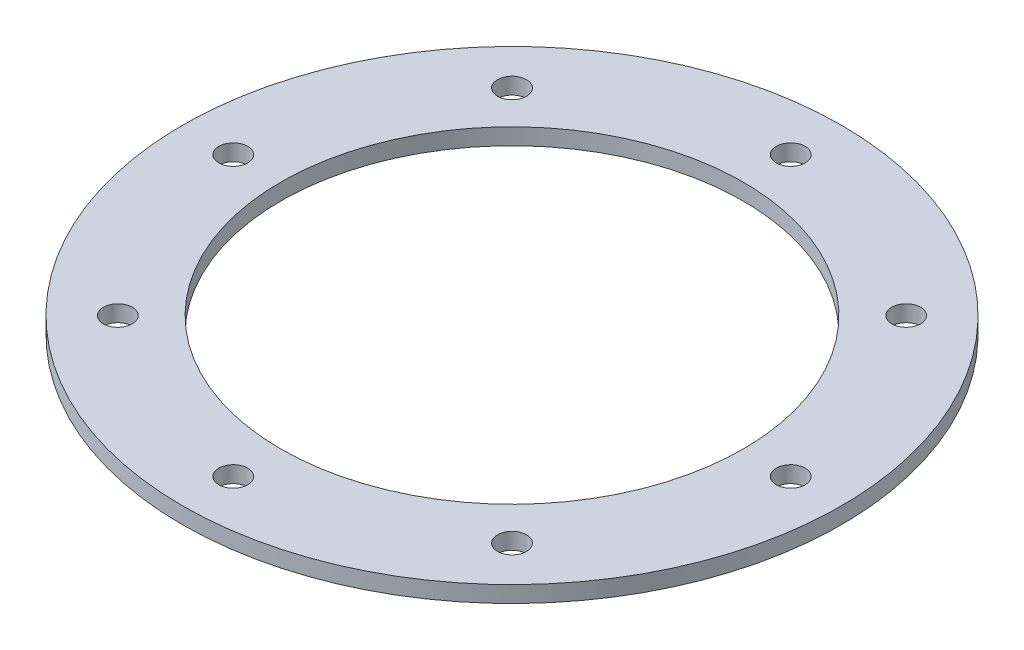
ISO-10303-21;
HEADER;
FILE_DESCRIPTION(('STEP AP214'),'2;1');
FILE_NAME('part.step','',(''),(''),'','','');
FILE_SCHEMA(('AUTOMOTIVE_DESIGN { 1 0 10303 214 1 1 1 1 }'));
ENDSEC;
DATA;
#1=APPLICATION_CONTEXT('core data for automotive mechanical design processes');
#2=APPLICATION_PROTOCOL_DEFINITION('international standard','automotive_design',2000,#1);
#3=PRODUCT_CONTEXT('',#1,'mechanical');
#4=PRODUCT('Part','Part','',(#3));
#5=PRODUCT_RELATED_PRODUCT_CATEGORY('part','',(#4));
#6=PRODUCT_DEFINITION_FORMATION('','',#4);
#7=PRODUCT_DEFINITION_CONTEXT('part definition',#1,'design');
#8=PRODUCT_DEFINITION('design','',#6,#7);
#9=PRODUCT_DEFINITION_SHAPE('','',#8);
#10=(LENGTH_UNIT() NAMED_UNIT(*) SI_UNIT(.MILLI.,.METRE.));
#11=(NAMED_UNIT(*) PLANE_ANGLE_UNIT() SI_UNIT($,.RADIAN.));
#12=(NAMED_UNIT(*) SI_UNIT($,.STERADIAN.) SOLID_ANGLE_UNIT());
#13=UNCERTAINTY_MEASURE_WITH_UNIT(LENGTH_MEASURE(1.E-05),#10,'distance_accuracy_value','');
#14=(GEOMETRIC_REPRESENTATION_CONTEXT(3) GLOBAL_UNCERTAINTY_ASSIGNED_CONTEXT((#13)) GLOBAL_UNIT_ASSIGNED_CONTEXT((#10,
#11,#12)) REPRESENTATION_CONTEXT('',''));
#15=CARTESIAN_POINT('',(0.,0.,0.));
#16=DIRECTION('',(0.,0.,1.));
#17=DIRECTION('',(1.,0.,0.));
#18=AXIS2_PLACEMENT_3D('',#15,#16,#17);
#19=CARTESIAN_POINT('',(0.,5.,0.));
#20=DIRECTION('',(0.,1.,0.));
#21=DIRECTION('',(0.,0.,1.));
#22=AXIS2_PLACEMENT_3D('',#19,#20,#21);
#23=PLANE('',#22);
#24=CARTESIAN_POINT('',(0.,5.,-85.));
#25=DIRECTION('',(0.,1.,0.));
#26=DIRECTION('',(0.,0.,1.));
#27=AXIS2_PLACEMENT_3D('',#24,#25,#26);
#28=CIRCLE('',#27,4.4);
#29=CARTESIAN_POINT('',(0.,5.,-80.6));
#30=VERTEX_POINT('',#29);
#31=EDGE_CURVE('E91',#30,#30,#28,.T.);
#32=ORIENTED_EDGE('',*,*,#31,.F.);
#33=EDGE_LOOP('',(#32));
#34=FACE_BOUND('',#33,.T.);
#35=CARTESIAN_POINT('',(-85.,5.,0.));
#36=DIRECTION('',(0.,1.,0.));
#37=DIRECTION('',(0.,0.,1.));
#38=AXIS2_PLACEMENT_3D('',#35,#36,#37);
#39=CIRCLE('',#38,4.4);
#40=CARTESIAN_POINT('',(-85.,5.,4.39999999999999));
#41=VERTEX_POINT('',#40);
#42=EDGE_CURVE('E79',#41,#41,#39,.T.);
#43=ORIENTED_EDGE('',*,*,#42,.F.);
#44=EDGE_LOOP('',(#43));
#45=FACE_BOUND('',#44,.T.);
#46=CARTESIAN_POINT('',(0.,5.,85.));
#47=DIRECTION('',(0.,1.,0.));
#48=DIRECTION('',(0.,0.,1.));
#49=AXIS2_PLACEMENT_3D('',#46,#47,#48);
#50=CIRCLE('',#49,4.4);
#51=CARTESIAN_POINT('',(0.,5.,89.4));
#52=VERTEX_POINT('',#51);
#53=EDGE_CURVE('E70',#52,#52,#50,.T.);
#54=ORIENTED_EDGE('',*,*,#53,.F.);
#55=EDGE_LOOP('',(#54));
#56=FACE_BOUND('',#55,.T.);
#57=CARTESIAN_POINT('',(85.,5.,0.));
#58=DIRECTION('',(0.,1.,0.));
#59=DIRECTION('',(0.,0.,1.));
#60=AXIS2_PLACEMENT_3D('',#57,#58,#59);
#61=CIRCLE('',#60,4.4);
#62=CARTESIAN_POINT('',(85.,5.,4.4));
#63=VERTEX_POINT('',#62);
#64=EDGE_CURVE('E54',#63,#63,#61,.T.);
#65=ORIENTED_EDGE('',*,*,#64,.F.);
#66=EDGE_LOOP('',(#65));
#67=FACE_BOUND('',#66,.T.);
#68=CARTESIAN_POINT('',(0.,5.,0.));
#69=DIRECTION('',(0.,1.,0.));
#70=DIRECTION('',(0.,0.,1.));
#71=AXIS2_PLACEMENT_3D('',#68,#69,#70);
#72=CIRCLE('',#71,100.5);
#73=CARTESIAN_POINT('',(0.,5.,100.5));
#74=VERTEX_POINT('',#73);
#75=EDGE_CURVE('E10',#74,#74,#72,.T.);
#76=ORIENTED_EDGE('',*,*,#75,.T.);
#77=EDGE_LOOP('',(#76));
#78=FACE_BOUND('',#77,.T.);
#79=CARTESIAN_POINT('',(0.,5.,0.));
#80=DIRECTION('',(0.,1.,0.));
#81=DIRECTION('',(0.,0.,1.));
#82=AXIS2_PLACEMENT_3D('',#79,#80,#81);
#83=CIRCLE('',#82,70.5);
#84=CARTESIAN_POINT('',(0.,5.,70.5));
#85=VERTEX_POINT('',#84);
#86=EDGE_CURVE('E49',#85,#85,#83,.T.);
#87=ORIENTED_EDGE('',*,*,#86,.F.);
#88=EDGE_LOOP('',(#87));
#89=FACE_BOUND('',#88,.T.);
#90=CARTESIAN_POINT('',(60.1040764008565,5.,60.1040764008565));
#91=DIRECTION('',(0.,1.,0.));
#92=DIRECTION('',(0.,0.,1.));
#93=AXIS2_PLACEMENT_3D('',#90,#91,#92);
#94=CIRCLE('',#93,4.39999999999997);
#95=CARTESIAN_POINT('',(60.1040764008565,5.,64.5040764008565));
#96=VERTEX_POINT('',#95);
#97=EDGE_CURVE('E61',#96,#96,#94,.T.);
#98=ORIENTED_EDGE('',*,*,#97,.F.);
#99=EDGE_LOOP('',(#98));
#100=FACE_BOUND('',#99,.T.);
#101=CARTESIAN_POINT('',(-60.1040764008565,5.,60.1040764008565));
#102=DIRECTION('',(0.,1.,0.));
#103=DIRECTION('',(0.,0.,1.));
#104=AXIS2_PLACEMENT_3D('',#101,#102,#103);
#105=CIRCLE('',#104,4.4);
#106=CARTESIAN_POINT('',(-60.1040764008565,5.,64.5040764008565));
#107=VERTEX_POINT('',#106);
#108=EDGE_CURVE('E74',#107,#107,#105,.T.);
#109=ORIENTED_EDGE('',*,*,#108,.F.);
#110=EDGE_LOOP('',(#109));
#111=FACE_BOUND('',#110,.T.);
#112=CARTESIAN_POINT('',(-60.1040764008565,5.,-60.1040764008566));
#113=DIRECTION('',(0.,1.,0.));
#114=DIRECTION('',(0.,0.,1.));
#115=AXIS2_PLACEMENT_3D('',#112,#113,#114);
#116=CIRCLE('',#115,4.4);
#117=CARTESIAN_POINT('',(-60.1040764008565,5.,-55.7040764008566));
#118=VERTEX_POINT('',#117);
#119=EDGE_CURVE('E84',#118,#118,#116,.T.);
#120=ORIENTED_EDGE('',*,*,#119,.F.);
#121=EDGE_LOOP('',(#120));
#122=FACE_BOUND('',#121,.T.);
#123=CARTESIAN_POINT('',(60.1040764008566,5.,-60.1040764008565));
#124=DIRECTION('',(0.,1.,0.));
#125=DIRECTION('',(0.,0.,1.));
#126=AXIS2_PLACEMENT_3D('',#123,#124,#125);
#127=CIRCLE('',#126,4.4);
#128=CARTESIAN_POINT('',(60.1040764008566,5.,-55.7040764008565));
#129=VERTEX_POINT('',#128);
#130=EDGE_CURVE('E97',#129,#129,#127,.T.);
#131=ORIENTED_EDGE('',*,*,#130,.F.);
#132=EDGE_LOOP('',(#131));
#133=FACE_BOUND('',#132,.T.);
#134=ADVANCED_FACE('F39',(#34,#45,#56,#67,#78,#89,#100,#111,#122,#133),#23,.T.);
#135=CARTESIAN_POINT('',(0.,0.,0.));
#136=DIRECTION('',(0.,1.,0.));
#137=DIRECTION('',(0.,0.,1.));
#138=AXIS2_PLACEMENT_3D('',#135,#136,#137);
#139=PLANE('',#138);
#140=CARTESIAN_POINT('',(0.,0.,0.));
#141=DIRECTION('',(0.,1.,0.));
#142=DIRECTION('',(0.,0.,1.));
#143=AXIS2_PLACEMENT_3D('',#140,#141,#142);
#144=CIRCLE('',#143,100.5);
#145=CARTESIAN_POINT('',(0.,0.,100.5));
#146=VERTEX_POINT('',#145);
#147=EDGE_CURVE('E43',#146,#146,#144,.T.);
#148=ORIENTED_EDGE('',*,*,#147,.F.);
#149=EDGE_LOOP('',(#148));
#150=FACE_BOUND('',#149,.T.);
#151=CARTESIAN_POINT('',(0.,0.,0.));
#152=DIRECTION('',(0.,1.,0.));
#153=DIRECTION('',(0.,0.,1.));
#154=AXIS2_PLACEMENT_3D('',#151,#152,#153);
#155=CIRCLE('',#154,70.5);
#156=CARTESIAN_POINT('',(0.,0.,70.5));
#157=VERTEX_POINT('',#156);
#158=EDGE_CURVE('E55',#157,#157,#155,.T.);
#159=ORIENTED_EDGE('',*,*,#158,.T.);
#160=EDGE_LOOP('',(#159));
#161=FACE_BOUND('',#160,.T.);
#162=CARTESIAN_POINT('',(85.,0.,0.));
#163=DIRECTION('',(0.,1.,0.));
#164=DIRECTION('',(0.,0.,1.));
#165=AXIS2_PLACEMENT_3D('',#162,#163,#164);
#166=CIRCLE('',#165,4.4);
#167=CARTESIAN_POINT('',(85.,0.,4.4));
#168=VERTEX_POINT('',#167);
#169=EDGE_CURVE('E59',#168,#168,#166,.T.);
#170=ORIENTED_EDGE('',*,*,#169,.T.);
#171=EDGE_LOOP('',(#170));
#172=FACE_BOUND('',#171,.T.);
#173=CARTESIAN_POINT('',(60.1040764008565,0.,60.1040764008565));
#174=DIRECTION('',(0.,1.,0.));
#175=DIRECTION('',(0.,0.,1.));
#176=AXIS2_PLACEMENT_3D('',#173,#174,#175);
#177=CIRCLE('',#176,4.39999999999997);
#178=CARTESIAN_POINT('',(60.1040764008565,0.,64.5040764008565));
#179=VERTEX_POINT('',#178);
#180=EDGE_CURVE('E63',#179,#179,#177,.T.);
#181=ORIENTED_EDGE('',*,*,#180,.T.);
#182=EDGE_LOOP('',(#181));
#183=FACE_BOUND('',#182,.T.);
#184=CARTESIAN_POINT('',(0.,0.,85.));
#185=DIRECTION('',(0.,1.,0.));
#186=DIRECTION('',(0.,0.,1.));
#187=AXIS2_PLACEMENT_3D('',#184,#185,#186);
#188=CIRCLE('',#187,4.4);
#189=CARTESIAN_POINT('',(0.,0.,89.4));
#190=VERTEX_POINT('',#189);
#191=EDGE_CURVE('E69',#190,#190,#188,.T.);
#192=ORIENTED_EDGE('',*,*,#191,.T.);
#193=EDGE_LOOP('',(#192));
#194=FACE_BOUND('',#193,.T.);
#195=CARTESIAN_POINT('',(-60.1040764008565,0.,60.1040764008565));
#196=DIRECTION('',(0.,1.,0.));
#197=DIRECTION('',(0.,0.,1.));
#198=AXIS2_PLACEMENT_3D('',#195,#196,#197);
#199=CIRCLE('',#198,4.4);
#200=CARTESIAN_POINT('',(-60.1040764008565,0.,64.5040764008565));
#201=VERTEX_POINT('',#200);
#202=EDGE_CURVE('E77',#201,#201,#199,.T.);
#203=ORIENTED_EDGE('',*,*,#202,.T.);
#204=EDGE_LOOP('',(#203));
#205=FACE_BOUND('',#204,.T.);
#206=CARTESIAN_POINT('',(-85.,0.,0.));
#207=DIRECTION('',(0.,1.,0.));
#208=DIRECTION('',(0.,0.,1.));
#209=AXIS2_PLACEMENT_3D('',#206,#207,#208);
#210=CIRCLE('',#209,4.4);
#211=CARTESIAN_POINT('',(-85.,0.,4.39999999999999));
#212=VERTEX_POINT('',#211);
#213=EDGE_CURVE('E85',#212,#212,#210,.T.);
#214=ORIENTED_EDGE('',*,*,#213,.T.);
#215=EDGE_LOOP('',(#214));
#216=FACE_BOUND('',#215,.T.);
#217=CARTESIAN_POINT('',(-60.1040764008565,0.,-60.1040764008566));
#218=DIRECTION('',(0.,1.,0.));
#219=DIRECTION('',(0.,0.,1.));
#220=AXIS2_PLACEMENT_3D('',#217,#218,#219);
#221=CIRCLE('',#220,4.4);
#222=CARTESIAN_POINT('',(-60.1040764008565,0.,-55.7040764008566));
#223=VERTEX_POINT('',#222);
#224=EDGE_CURVE('E87',#223,#223,#221,.T.);
#225=ORIENTED_EDGE('',*,*,#224,.T.);
#226=EDGE_LOOP('',(#225));
#227=FACE_BOUND('',#226,.T.);
#228=CARTESIAN_POINT('',(0.,0.,-85.));
#229=DIRECTION('',(0.,1.,0.));
#230=DIRECTION('',(0.,0.,1.));
#231=AXIS2_PLACEMENT_3D('',#228,#229,#230);
#232=CIRCLE('',#231,4.4);
#233=CARTESIAN_POINT('',(0.,0.,-80.6));
#234=VERTEX_POINT('',#233);
#235=EDGE_CURVE('E93',#234,#234,#232,.T.);
#236=ORIENTED_EDGE('',*,*,#235,.T.);
#237=EDGE_LOOP('',(#236));
#238=FACE_BOUND('',#237,.T.);
#239=CARTESIAN_POINT('',(60.1040764008566,0.,-60.1040764008565));
#240=DIRECTION('',(0.,1.,0.));
#241=DIRECTION('',(0.,0.,1.));
#242=AXIS2_PLACEMENT_3D('',#239,#240,#241);
#243=CIRCLE('',#242,4.4);
#244=CARTESIAN_POINT('',(60.1040764008566,0.,-55.7040764008565));
#245=VERTEX_POINT('',#244);
#246=EDGE_CURVE('E99',#245,#245,#243,.T.);
#247=ORIENTED_EDGE('',*,*,#246,.T.);
#248=EDGE_LOOP('',(#247));
#249=FACE_BOUND('',#248,.T.);
#250=ADVANCED_FACE('F109',(#150,#161,#172,#183,#194,#205,#216,#227,#238,#249),#139,.F.);
#251=CARTESIAN_POINT('',(0.,5.,0.));
#252=DIRECTION('',(0.,-1.,0.));
#253=DIRECTION('',(0.,0.,-1.));
#254=AXIS2_PLACEMENT_3D('',#251,#252,#253);
#255=CYLINDRICAL_SURFACE('',#254,100.5);
#256=ORIENTED_EDGE('',*,*,#75,.F.);
#257=EDGE_LOOP('',(#256));
#258=FACE_BOUND('',#257,.T.);
#259=ORIENTED_EDGE('',*,*,#147,.T.);
#260=EDGE_LOOP('',(#259));
#261=FACE_BOUND('',#260,.T.);
#262=ADVANCED_FACE('F41',(#258,#261),#255,.T.);
#263=CARTESIAN_POINT('',(0.,5.,0.));
#264=DIRECTION('',(0.,-1.,0.));
#265=DIRECTION('',(0.,0.,-1.));
#266=AXIS2_PLACEMENT_3D('',#263,#264,#265);
#267=CYLINDRICAL_SURFACE('',#266,70.5);
#268=ORIENTED_EDGE('',*,*,#86,.T.);
#269=EDGE_LOOP('',(#268));
#270=FACE_BOUND('',#269,.T.);
#271=ORIENTED_EDGE('',*,*,#158,.F.);
#272=EDGE_LOOP('',(#271));
#273=FACE_BOUND('',#272,.T.);
#274=ADVANCED_FACE('F119',(#270,#273),#267,.F.);
#275=CARTESIAN_POINT('',(85.,5.,0.));
#276=DIRECTION('',(0.,-1.,0.));
#277=DIRECTION('',(0.,0.,-1.));
#278=AXIS2_PLACEMENT_3D('',#275,#276,#277);
#279=CYLINDRICAL_SURFACE('',#278,4.4);
#280=ORIENTED_EDGE('',*,*,#64,.T.);
#281=EDGE_LOOP('',(#280));
#282=FACE_BOUND('',#281,.T.);
#283=ORIENTED_EDGE('',*,*,#169,.F.);
#284=EDGE_LOOP('',(#283));
#285=FACE_BOUND('',#284,.T.);
#286=ADVANCED_FACE('F124',(#282,#285),#279,.F.);
#287=CARTESIAN_POINT('',(60.1040764008565,5.,60.1040764008565));
#288=DIRECTION('',(0.,-1.,0.));
#289=DIRECTION('',(0.,0.,-1.));
#290=AXIS2_PLACEMENT_3D('',#287,#288,#289);
#291=CYLINDRICAL_SURFACE('',#290,4.39999999999997);
#292=ORIENTED_EDGE('',*,*,#97,.T.);
#293=EDGE_LOOP('',(#292));
#294=FACE_BOUND('',#293,.T.);
#295=ORIENTED_EDGE('',*,*,#180,.F.);
#296=EDGE_LOOP('',(#295));
#297=FACE_BOUND('',#296,.T.);
#298=ADVANCED_FACE('F130',(#294,#297),#291,.F.);
#299=CARTESIAN_POINT('',(0.,5.,85.));
#300=DIRECTION('',(0.,-1.,0.));
#301=DIRECTION('',(0.,0.,-1.));
#302=AXIS2_PLACEMENT_3D('',#299,#300,#301);
#303=CYLINDRICAL_SURFACE('',#302,4.4);
#304=ORIENTED_EDGE('',*,*,#53,.T.);
#305=EDGE_LOOP('',(#304));
#306=FACE_BOUND('',#305,.T.);
#307=ORIENTED_EDGE('',*,*,#191,.F.);
#308=EDGE_LOOP('',(#307));
#309=FACE_BOUND('',#308,.T.);
#310=ADVANCED_FACE('F131',(#306,#309),#303,.F.);
#311=CARTESIAN_POINT('',(-60.1040764008565,5.,60.1040764008565));
#312=DIRECTION('',(0.,-1.,0.));
#313=DIRECTION('',(0.,0.,-1.));
#314=AXIS2_PLACEMENT_3D('',#311,#312,#313);
#315=CYLINDRICAL_SURFACE('',#314,4.4);
#316=ORIENTED_EDGE('',*,*,#108,.T.);
#317=EDGE_LOOP('',(#316));
#318=FACE_BOUND('',#317,.T.);
#319=ORIENTED_EDGE('',*,*,#202,.F.);
#320=EDGE_LOOP('',(#319));
#321=FACE_BOUND('',#320,.T.);
#322=ADVANCED_FACE('F134',(#318,#321),#315,.F.);
#323=CARTESIAN_POINT('',(-85.,5.,0.));
#324=DIRECTION('',(0.,-1.,0.));
#325=DIRECTION('',(0.,0.,-1.));
#326=AXIS2_PLACEMENT_3D('',#323,#324,#325);
#327=CYLINDRICAL_SURFACE('',#326,4.4);
#328=ORIENTED_EDGE('',*,*,#42,.T.);
#329=EDGE_LOOP('',(#328));
#330=FACE_BOUND('',#329,.T.);
#331=ORIENTED_EDGE('',*,*,#213,.F.);
#332=EDGE_LOOP('',(#331));
#333=FACE_BOUND('',#332,.T.);
#334=ADVANCED_FACE('F138',(#330,#333),#327,.F.);
#335=CARTESIAN_POINT('',(-60.1040764008565,5.,-60.1040764008566));
#336=DIRECTION('',(0.,-1.,0.));
#337=DIRECTION('',(0.,0.,-1.));
#338=AXIS2_PLACEMENT_3D('',#335,#336,#337);
#339=CYLINDRICAL_SURFACE('',#338,4.4);
#340=ORIENTED_EDGE('',*,*,#119,.T.);
#341=EDGE_LOOP('',(#340));
#342=FACE_BOUND('',#341,.T.);
#343=ORIENTED_EDGE('',*,*,#224,.F.);
#344=EDGE_LOOP('',(#343));
#345=FACE_BOUND('',#344,.T.);
#346=ADVANCED_FACE('F141',(#342,#345),#339,.F.);
#347=CARTESIAN_POINT('',(0.,5.,-85.));
#348=DIRECTION('',(0.,-1.,0.));
#349=DIRECTION('',(0.,0.,-1.));
#350=AXIS2_PLACEMENT_3D('',#347,#348,#349);
#351=CYLINDRICAL_SURFACE('',#350,4.4);
#352=ORIENTED_EDGE('',*,*,#31,.T.);
#353=EDGE_LOOP('',(#352));
#354=FACE_BOUND('',#353,.T.);
#355=ORIENTED_EDGE('',*,*,#235,.F.);
#356=EDGE_LOOP('',(#355));
#357=FACE_BOUND('',#356,.T.);
#358=ADVANCED_FACE('F150',(#354,#357),#351,.F.);
#359=CARTESIAN_POINT('',(60.1040764008566,5.,-60.1040764008565));
#360=DIRECTION('',(0.,-1.,0.));
#361=DIRECTION('',(0.,0.,-1.));
#362=AXIS2_PLACEMENT_3D('',#359,#360,#361);
#363=CYLINDRICAL_SURFACE('',#362,4.4);
#364=ORIENTED_EDGE('',*,*,#130,.T.);
#365=EDGE_LOOP('',(#364));
#366=FACE_BOUND('',#365,.T.);
#367=ORIENTED_EDGE('',*,*,#246,.F.);
#368=EDGE_LOOP('',(#367));
#369=FACE_BOUND('',#368,.T.);
#370=ADVANCED_FACE('F106',(#366,#369),#363,.F.);
#371=CLOSED_SHELL('',(#134,#250,#262,#274,#286,#298,#310,#322,#334,#346,#358,#370));
#372=MANIFOLD_SOLID_BREP('B2',#371);
#373=ADVANCED_BREP_SHAPE_REPRESENTATION('',(#18,#372),#14);
#374=SHAPE_DEFINITION_REPRESENTATION(#9,#373);
ENDSEC;
END-ISO-10303-21;
